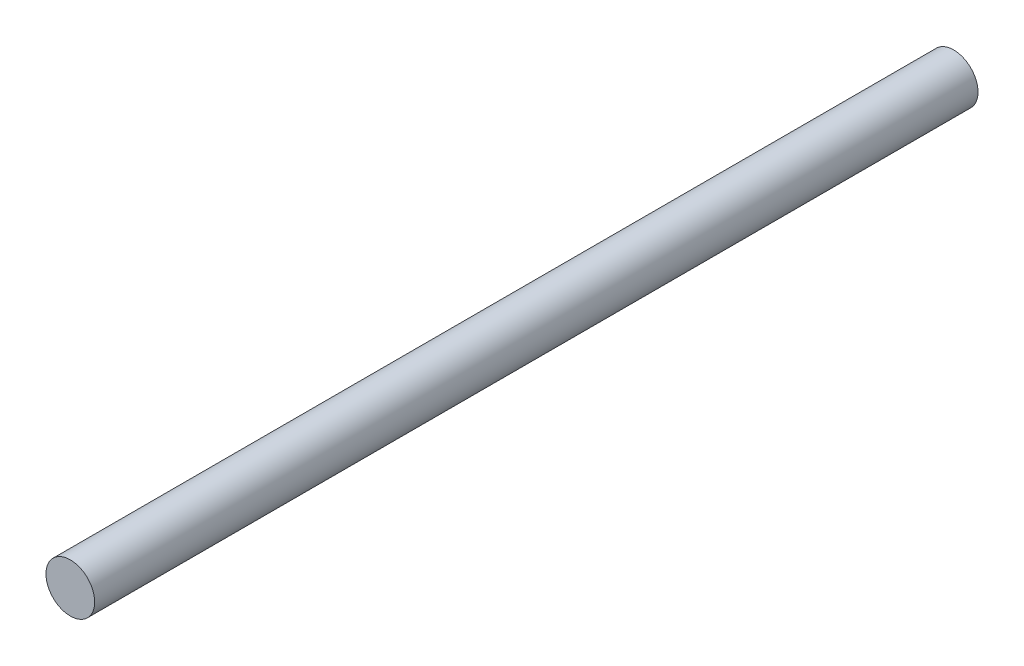
ISO-10303-21;
HEADER;
FILE_DESCRIPTION(('STEP AP214'),'2;1');
FILE_NAME('part.step','',(''),(''),'','','');
FILE_SCHEMA(('AUTOMOTIVE_DESIGN { 1 0 10303 214 1 1 1 1 }'));
ENDSEC;
DATA;
#1=APPLICATION_CONTEXT('core data for automotive mechanical design processes');
#2=APPLICATION_PROTOCOL_DEFINITION('international standard','automotive_design',2000,#1);
#3=PRODUCT_CONTEXT('',#1,'mechanical');
#4=PRODUCT('Part','Part','',(#3));
#5=PRODUCT_RELATED_PRODUCT_CATEGORY('part','',(#4));
#6=PRODUCT_DEFINITION_FORMATION('','',#4);
#7=PRODUCT_DEFINITION_CONTEXT('part definition',#1,'design');
#8=PRODUCT_DEFINITION('design','',#6,#7);
#9=PRODUCT_DEFINITION_SHAPE('','',#8);
#10=(LENGTH_UNIT() NAMED_UNIT(*) SI_UNIT(.MILLI.,.METRE.));
#11=(NAMED_UNIT(*) PLANE_ANGLE_UNIT() SI_UNIT($,.RADIAN.));
#12=(NAMED_UNIT(*) SI_UNIT($,.STERADIAN.) SOLID_ANGLE_UNIT());
#13=UNCERTAINTY_MEASURE_WITH_UNIT(LENGTH_MEASURE(1.E-05),#10,'distance_accuracy_value','');
#14=(GEOMETRIC_REPRESENTATION_CONTEXT(3) GLOBAL_UNCERTAINTY_ASSIGNED_CONTEXT((#13)) GLOBAL_UNIT_ASSIGNED_CONTEXT((#10,
#11,#12)) REPRESENTATION_CONTEXT('',''));
#15=CARTESIAN_POINT('',(0.,0.,0.));
#16=DIRECTION('',(0.,0.,1.));
#17=DIRECTION('',(1.,0.,0.));
#18=AXIS2_PLACEMENT_3D('',#15,#16,#17);
#19=CARTESIAN_POINT('',(0.,0.,145.));
#20=DIRECTION('',(0.,0.,-1.));
#21=DIRECTION('',(-1.,0.,0.));
#22=AXIS2_PLACEMENT_3D('',#19,#20,#21);
#23=CYLINDRICAL_SURFACE('',#22,4.);
#24=CARTESIAN_POINT('',(0.,0.,145.));
#25=DIRECTION('',(0.,0.,1.));
#26=DIRECTION('',(1.,0.,0.));
#27=AXIS2_PLACEMENT_3D('',#24,#25,#26);
#28=CIRCLE('',#27,4.);
#29=CARTESIAN_POINT('',(4.,0.,145.));
#30=VERTEX_POINT('',#29);
#31=EDGE_CURVE('E10',#30,#30,#28,.T.);
#32=ORIENTED_EDGE('',*,*,#31,.F.);
#33=EDGE_LOOP('',(#32));
#34=FACE_BOUND('',#33,.T.);
#35=CARTESIAN_POINT('',(0.,0.,0.));
#36=DIRECTION('',(0.,0.,1.));
#37=DIRECTION('',(1.,0.,0.));
#38=AXIS2_PLACEMENT_3D('',#35,#36,#37);
#39=CIRCLE('',#38,4.);
#40=CARTESIAN_POINT('',(4.,0.,0.));
#41=VERTEX_POINT('',#40);
#42=EDGE_CURVE('E42',#41,#41,#39,.T.);
#43=ORIENTED_EDGE('',*,*,#42,.T.);
#44=EDGE_LOOP('',(#43));
#45=FACE_BOUND('',#44,.T.);
#46=ADVANCED_FACE('F39',(#34,#45),#23,.T.);
#47=CARTESIAN_POINT('',(0.,0.,145.));
#48=DIRECTION('',(0.,0.,1.));
#49=DIRECTION('',(1.,0.,0.));
#50=AXIS2_PLACEMENT_3D('',#47,#48,#49);
#51=PLANE('',#50);
#52=ORIENTED_EDGE('',*,*,#31,.T.);
#53=EDGE_LOOP('',(#52));
#54=FACE_BOUND('',#53,.T.);
#55=ADVANCED_FACE('F58',(#54),#51,.T.);
#56=CARTESIAN_POINT('',(0.,0.,0.));
#57=DIRECTION('',(0.,0.,1.));
#58=DIRECTION('',(1.,0.,0.));
#59=AXIS2_PLACEMENT_3D('',#56,#57,#58);
#60=PLANE('',#59);
#61=ORIENTED_EDGE('',*,*,#42,.F.);
#62=EDGE_LOOP('',(#61));
#63=FACE_BOUND('',#62,.T.);
#64=ADVANCED_FACE('F56',(#63),#60,.F.);
#65=CLOSED_SHELL('',(#46,#55,#64));
#66=MANIFOLD_SOLID_BREP('B2',#65);
#67=ADVANCED_BREP_SHAPE_REPRESENTATION('',(#18,#66),#14);
#68=SHAPE_DEFINITION_REPRESENTATION(#9,#67);
ENDSEC;
END-ISO-10303-21;
